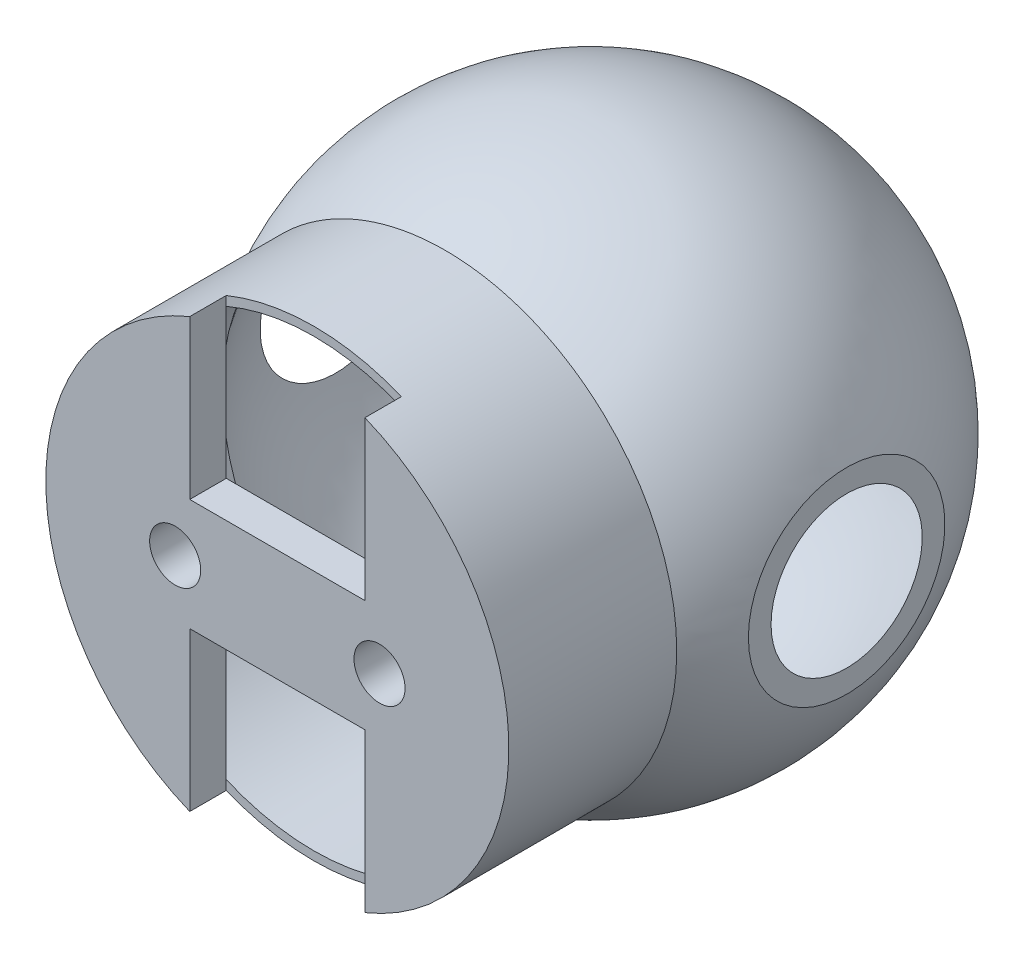
ISO-10303-21;
HEADER;
FILE_DESCRIPTION(('STEP AP214'),'2;1');
FILE_NAME('part.step','',(''),(''),'','','');
FILE_SCHEMA(('AUTOMOTIVE_DESIGN { 1 0 10303 214 1 1 1 1 }'));
ENDSEC;
DATA;
#1=APPLICATION_CONTEXT('core data for automotive mechanical design processes');
#2=APPLICATION_PROTOCOL_DEFINITION('international standard','automotive_design',2000,#1);
#3=PRODUCT_CONTEXT('',#1,'mechanical');
#4=PRODUCT('Part','Part','',(#3));
#5=PRODUCT_RELATED_PRODUCT_CATEGORY('part','',(#4));
#6=PRODUCT_DEFINITION_FORMATION('','',#4);
#7=PRODUCT_DEFINITION_CONTEXT('part definition',#1,'design');
#8=PRODUCT_DEFINITION('design','',#6,#7);
#9=PRODUCT_DEFINITION_SHAPE('','',#8);
#10=(LENGTH_UNIT() NAMED_UNIT(*) SI_UNIT(.MILLI.,.METRE.));
#11=(NAMED_UNIT(*) PLANE_ANGLE_UNIT() SI_UNIT($,.RADIAN.));
#12=(NAMED_UNIT(*) SI_UNIT($,.STERADIAN.) SOLID_ANGLE_UNIT());
#13=UNCERTAINTY_MEASURE_WITH_UNIT(LENGTH_MEASURE(1.E-05),#10,'distance_accuracy_value','');
#14=(GEOMETRIC_REPRESENTATION_CONTEXT(3) GLOBAL_UNCERTAINTY_ASSIGNED_CONTEXT((#13)) GLOBAL_UNIT_ASSIGNED_CONTEXT((#10,
#11,#12)) REPRESENTATION_CONTEXT('',''));
#15=CARTESIAN_POINT('',(0.,0.,0.));
#16=DIRECTION('',(0.,0.,1.));
#17=DIRECTION('',(1.,0.,0.));
#18=AXIS2_PLACEMENT_3D('',#15,#16,#17);
#19=CARTESIAN_POINT('',(0.,0.,38.));
#20=DIRECTION('',(0.,0.,1.));
#21=DIRECTION('',(1.,0.,0.));
#22=AXIS2_PLACEMENT_3D('',#19,#20,#21);
#23=PLANE('',#22);
#24=DIRECTION('',(0.,-1.,0.));
#25=VECTOR('',#24,1.);
#26=CARTESIAN_POINT('',(12.,29.364093720052,38.));
#27=LINE('',#26,#25);
#28=CARTESIAN_POINT('',(12.,29.364093720052,38.));
#29=VERTEX_POINT('',#28);
#30=CARTESIAN_POINT('',(12.,28.0757902827329,38.));
#31=VERTEX_POINT('',#30);
#32=EDGE_CURVE('E206',#29,#31,#27,.T.);
#33=ORIENTED_EDGE('',*,*,#32,.F.);
#34=CARTESIAN_POINT('',(0.,0.,38.));
#35=DIRECTION('',(0.,0.,1.));
#36=DIRECTION('',(1.,0.,0.));
#37=AXIS2_PLACEMENT_3D('',#34,#35,#36);
#38=CIRCLE('',#37,31.7214438511238);
#39=CARTESIAN_POINT('',(-12.,29.364093720052,38.));
#40=VERTEX_POINT('',#39);
#41=EDGE_CURVE('E155',#29,#40,#38,.T.);
#42=ORIENTED_EDGE('',*,*,#41,.T.);
#43=DIRECTION('',(0.,1.,0.));
#44=VECTOR('',#43,1.);
#45=CARTESIAN_POINT('',(-12.,29.364093720052,38.));
#46=LINE('',#45,#44);
#47=CARTESIAN_POINT('',(-12.,28.0757902827329,38.));
#48=VERTEX_POINT('',#47);
#49=EDGE_CURVE('E44',#48,#40,#46,.T.);
#50=ORIENTED_EDGE('',*,*,#49,.F.);
#51=CARTESIAN_POINT('',(0.,0.,38.));
#52=DIRECTION('',(0.,0.,1.));
#53=DIRECTION('',(1.,0.,0.));
#54=AXIS2_PLACEMENT_3D('',#51,#52,#53);
#55=CIRCLE('',#54,30.532769281544);
#56=EDGE_CURVE('E140',#31,#48,#55,.T.);
#57=ORIENTED_EDGE('',*,*,#56,.F.);
#58=EDGE_LOOP('',(#33,#42,#50,#57));
#59=FACE_BOUND('',#58,.T.);
#60=ADVANCED_FACE('F35',(#59),#23,.T.);
#61=CARTESIAN_POINT('',(0.,0.,0.));
#62=DIRECTION('',(0.,1.,0.));
#63=DIRECTION('',(-1.,0.,0.));
#64=AXIS2_PLACEMENT_3D('',#61,#62,#63);
#65=SPHERICAL_SURFACE('',#64,37.5);
#66=CARTESIAN_POINT('',(35.,0.,0.));
#67=DIRECTION('',(-1.,0.,0.));
#68=DIRECTION('',(0.,0.,1.));
#69=AXIS2_PLACEMENT_3D('',#66,#67,#68);
#70=CIRCLE('',#69,13.4629120178363);
#71=CARTESIAN_POINT('',(35.,0.,13.4629120178363));
#72=VERTEX_POINT('',#71);
#73=EDGE_CURVE('E154',#72,#72,#70,.F.);
#74=ORIENTED_EDGE('',*,*,#73,.F.);
#75=EDGE_LOOP('',(#74));
#76=FACE_BOUND('',#75,.T.);
#77=CARTESIAN_POINT('',(-35.,0.,0.));
#78=DIRECTION('',(1.,0.,0.));
#79=DIRECTION('',(0.,0.,-1.));
#80=AXIS2_PLACEMENT_3D('',#77,#78,#79);
#81=CIRCLE('',#80,13.4629120178363);
#82=CARTESIAN_POINT('',(-35.,0.,-13.4629120178363));
#83=VERTEX_POINT('',#82);
#84=EDGE_CURVE('E161',#83,#83,#81,.F.);
#85=ORIENTED_EDGE('',*,*,#84,.F.);
#86=EDGE_LOOP('',(#85));
#87=FACE_BOUND('',#86,.T.);
#88=CARTESIAN_POINT('',(0.,0.,20.));
#89=DIRECTION('',(0.,0.,1.));
#90=DIRECTION('',(1.,0.,0.));
#91=AXIS2_PLACEMENT_3D('',#88,#89,#90);
#92=CIRCLE('',#91,31.7214438511238);
#93=CARTESIAN_POINT('',(31.7214438511238,0.,20.));
#94=VERTEX_POINT('',#93);
#95=EDGE_CURVE('E146',#94,#94,#92,.T.);
#96=ORIENTED_EDGE('',*,*,#95,.F.);
#97=EDGE_LOOP('',(#96));
#98=FACE_BOUND('',#97,.T.);
#99=ADVANCED_FACE('F37',(#76,#87,#98),#65,.T.);
#100=CARTESIAN_POINT('',(0.,0.,0.));
#101=DIRECTION('',(0.,1.,0.));
#102=DIRECTION('',(-1.,0.,0.));
#103=AXIS2_PLACEMENT_3D('',#100,#101,#102);
#104=SPHERICAL_SURFACE('',#103,36.5);
#105=CARTESIAN_POINT('',(35.,0.,0.));
#106=DIRECTION('',(-1.,0.,0.));
#107=DIRECTION('',(0.,0.,1.));
#108=AXIS2_PLACEMENT_3D('',#105,#106,#107);
#109=CIRCLE('',#108,10.356157588604);
#110=CARTESIAN_POINT('',(35.,0.,10.356157588604));
#111=VERTEX_POINT('',#110);
#112=EDGE_CURVE('E151',#111,#111,#109,.F.);
#113=ORIENTED_EDGE('',*,*,#112,.T.);
#114=EDGE_LOOP('',(#113));
#115=FACE_BOUND('',#114,.T.);
#116=CARTESIAN_POINT('',(-35.,0.,0.));
#117=DIRECTION('',(1.,0.,0.));
#118=DIRECTION('',(0.,0.,-1.));
#119=AXIS2_PLACEMENT_3D('',#116,#117,#118);
#120=CIRCLE('',#119,10.356157588604);
#121=CARTESIAN_POINT('',(-35.,0.,-10.356157588604));
#122=VERTEX_POINT('',#121);
#123=EDGE_CURVE('E158',#122,#122,#120,.F.);
#124=ORIENTED_EDGE('',*,*,#123,.T.);
#125=EDGE_LOOP('',(#124));
#126=FACE_BOUND('',#125,.T.);
#127=CARTESIAN_POINT('',(0.,0.,20.));
#128=DIRECTION('',(0.,0.,1.));
#129=DIRECTION('',(1.,0.,0.));
#130=AXIS2_PLACEMENT_3D('',#127,#128,#129);
#131=CIRCLE('',#130,30.532769281544);
#132=CARTESIAN_POINT('',(30.532769281544,0.,20.));
#133=VERTEX_POINT('',#132);
#134=EDGE_CURVE('E164',#133,#133,#131,.F.);
#135=ORIENTED_EDGE('',*,*,#134,.F.);
#136=EDGE_LOOP('',(#135));
#137=FACE_BOUND('',#136,.T.);
#138=ADVANCED_FACE('F257',(#115,#126,#137),#104,.F.);
#139=CARTESIAN_POINT('',(-35.,0.,0.));
#140=DIRECTION('',(1.,0.,0.));
#141=DIRECTION('',(0.,0.,-1.));
#142=AXIS2_PLACEMENT_3D('',#139,#140,#141);
#143=PLANE('',#142);
#144=ORIENTED_EDGE('',*,*,#123,.F.);
#145=EDGE_LOOP('',(#144));
#146=FACE_BOUND('',#145,.T.);
#147=ORIENTED_EDGE('',*,*,#84,.T.);
#148=EDGE_LOOP('',(#147));
#149=FACE_BOUND('',#148,.T.);
#150=ADVANCED_FACE('F267',(#146,#149),#143,.F.);
#151=CARTESIAN_POINT('',(35.,0.,0.));
#152=DIRECTION('',(-1.,0.,0.));
#153=DIRECTION('',(0.,0.,-1.));
#154=AXIS2_PLACEMENT_3D('',#151,#152,#153);
#155=PLANE('',#154);
#156=ORIENTED_EDGE('',*,*,#112,.F.);
#157=EDGE_LOOP('',(#156));
#158=FACE_BOUND('',#157,.T.);
#159=ORIENTED_EDGE('',*,*,#73,.T.);
#160=EDGE_LOOP('',(#159));
#161=FACE_BOUND('',#160,.T.);
#162=ADVANCED_FACE('F261',(#158,#161),#155,.F.);
#163=DIRECTION('',(0.,-1.,0.));
#164=VECTOR('',#163,1.);
#165=CARTESIAN_POINT('',(12.,-7.66336994854413,38.));
#166=LINE('',#165,#164);
#167=CARTESIAN_POINT('',(12.,-28.0757902827329,38.));
#168=VERTEX_POINT('',#167);
#169=CARTESIAN_POINT('',(12.,-29.364093720052,38.));
#170=VERTEX_POINT('',#169);
#171=EDGE_CURVE('E11',#168,#170,#166,.T.);
#172=ORIENTED_EDGE('',*,*,#171,.F.);
#173=CARTESIAN_POINT('',(-12.,-28.0757902827329,38.));
#174=VERTEX_POINT('',#173);
#175=EDGE_CURVE('E54',#174,#168,#55,.T.);
#176=ORIENTED_EDGE('',*,*,#175,.F.);
#177=DIRECTION('',(0.,1.,0.));
#178=VECTOR('',#177,1.);
#179=CARTESIAN_POINT('',(-12.,-7.66336994854413,38.));
#180=LINE('',#179,#178);
#181=CARTESIAN_POINT('',(-12.,-29.364093720052,38.));
#182=VERTEX_POINT('',#181);
#183=EDGE_CURVE('E186',#182,#174,#180,.T.);
#184=ORIENTED_EDGE('',*,*,#183,.F.);
#185=EDGE_CURVE('E150',#182,#170,#38,.T.);
#186=ORIENTED_EDGE('',*,*,#185,.T.);
#187=EDGE_LOOP('',(#172,#176,#184,#186));
#188=FACE_BOUND('',#187,.T.);
#189=ADVANCED_FACE('F253',(#188),#23,.T.);
#190=CARTESIAN_POINT('',(0.,0.,38.));
#191=DIRECTION('',(0.,0.,-1.));
#192=DIRECTION('',(-1.,0.,0.));
#193=AXIS2_PLACEMENT_3D('',#190,#191,#192);
#194=CYLINDRICAL_SURFACE('',#193,31.7214438511238);
#195=ORIENTED_EDGE('',*,*,#41,.F.);
#196=DIRECTION('',(0.,0.,-1.));
#197=VECTOR('',#196,1.);
#198=CARTESIAN_POINT('',(12.,29.364093720052,43.));
#199=LINE('',#198,#197);
#200=CARTESIAN_POINT('',(12.,29.364093720052,43.));
#201=VERTEX_POINT('',#200);
#202=EDGE_CURVE('E203',#201,#29,#199,.T.);
#203=ORIENTED_EDGE('',*,*,#202,.F.);
#204=CARTESIAN_POINT('',(0.,0.,43.));
#205=DIRECTION('',(0.,0.,1.));
#206=DIRECTION('',(1.,0.,0.));
#207=AXIS2_PLACEMENT_3D('',#204,#205,#206);
#208=CIRCLE('',#207,31.7214438511238);
#209=CARTESIAN_POINT('',(12.,-29.364093720052,43.));
#210=VERTEX_POINT('',#209);
#211=EDGE_CURVE('E126',#210,#201,#208,.T.);
#212=ORIENTED_EDGE('',*,*,#211,.F.);
#213=DIRECTION('',(0.,0.,-1.));
#214=VECTOR('',#213,1.);
#215=CARTESIAN_POINT('',(12.,-29.364093720052,43.));
#216=LINE('',#215,#214);
#217=EDGE_CURVE('E199',#210,#170,#216,.T.);
#218=ORIENTED_EDGE('',*,*,#217,.T.);
#219=ORIENTED_EDGE('',*,*,#185,.F.);
#220=DIRECTION('',(0.,0.,-1.));
#221=VECTOR('',#220,1.);
#222=CARTESIAN_POINT('',(-12.,-29.364093720052,43.));
#223=LINE('',#222,#221);
#224=CARTESIAN_POINT('',(-12.,-29.364093720052,43.));
#225=VERTEX_POINT('',#224);
#226=EDGE_CURVE('E193',#225,#182,#223,.T.);
#227=ORIENTED_EDGE('',*,*,#226,.F.);
#228=CARTESIAN_POINT('',(0.,0.,43.));
#229=DIRECTION('',(0.,0.,1.));
#230=DIRECTION('',(1.,0.,0.));
#231=AXIS2_PLACEMENT_3D('',#228,#229,#230);
#232=CIRCLE('',#231,31.7214438511238);
#233=CARTESIAN_POINT('',(-12.,29.364093720052,43.));
#234=VERTEX_POINT('',#233);
#235=EDGE_CURVE('E217',#234,#225,#232,.T.);
#236=ORIENTED_EDGE('',*,*,#235,.F.);
#237=DIRECTION('',(0.,0.,-1.));
#238=VECTOR('',#237,1.);
#239=CARTESIAN_POINT('',(-12.,29.364093720052,43.));
#240=LINE('',#239,#238);
#241=EDGE_CURVE('E141',#234,#40,#240,.T.);
#242=ORIENTED_EDGE('',*,*,#241,.T.);
#243=EDGE_LOOP('',(#195,#203,#212,#218,#219,#227,#236,#242));
#244=FACE_BOUND('',#243,.T.);
#245=ORIENTED_EDGE('',*,*,#95,.T.);
#246=EDGE_LOOP('',(#245));
#247=FACE_BOUND('',#246,.T.);
#248=ADVANCED_FACE('F245',(#244,#247),#194,.T.);
#249=CARTESIAN_POINT('',(0.,0.,38.));
#250=DIRECTION('',(0.,0.,-1.));
#251=DIRECTION('',(-1.,0.,0.));
#252=AXIS2_PLACEMENT_3D('',#249,#250,#251);
#253=CYLINDRICAL_SURFACE('',#252,30.532769281544);
#254=ORIENTED_EDGE('',*,*,#56,.T.);
#255=EDGE_CURVE('E147',#48,#174,#55,.T.);
#256=ORIENTED_EDGE('',*,*,#255,.T.);
#257=ORIENTED_EDGE('',*,*,#175,.T.);
#258=EDGE_CURVE('E137',#168,#31,#55,.T.);
#259=ORIENTED_EDGE('',*,*,#258,.T.);
#260=EDGE_LOOP('',(#254,#256,#257,#259));
#261=FACE_BOUND('',#260,.T.);
#262=ORIENTED_EDGE('',*,*,#134,.T.);
#263=EDGE_LOOP('',(#262));
#264=FACE_BOUND('',#263,.T.);
#265=ADVANCED_FACE('F236',(#261,#264),#253,.F.);
#266=CARTESIAN_POINT('',(0.,0.,43.));
#267=DIRECTION('',(0.,0.,1.));
#268=DIRECTION('',(1.,0.,0.));
#269=AXIS2_PLACEMENT_3D('',#266,#267,#268);
#270=PLANE('',#269);
#271=CARTESIAN_POINT('',(14.,0.,43.));
#272=DIRECTION('',(0.,0.,1.));
#273=DIRECTION('',(1.,0.,0.));
#274=AXIS2_PLACEMENT_3D('',#271,#272,#273);
#275=CIRCLE('',#274,3.5);
#276=CARTESIAN_POINT('',(17.5,0.,43.));
#277=VERTEX_POINT('',#276);
#278=EDGE_CURVE('E209',#277,#277,#275,.T.);
#279=ORIENTED_EDGE('',*,*,#278,.F.);
#280=EDGE_LOOP('',(#279));
#281=FACE_BOUND('',#280,.T.);
#282=DIRECTION('',(0.,-1.,0.));
#283=VECTOR('',#282,1.);
#284=CARTESIAN_POINT('',(12.,29.364093720052,43.));
#285=LINE('',#284,#283);
#286=CARTESIAN_POINT('',(12.,7.66336994854413,43.));
#287=VERTEX_POINT('',#286);
#288=EDGE_CURVE('E120',#201,#287,#285,.T.);
#289=ORIENTED_EDGE('',*,*,#288,.T.);
#290=DIRECTION('',(-1.,0.,0.));
#291=VECTOR('',#290,1.);
#292=CARTESIAN_POINT('',(-12.,7.66336994854413,43.));
#293=LINE('',#292,#291);
#294=CARTESIAN_POINT('',(-12.,7.66336994854413,43.));
#295=VERTEX_POINT('',#294);
#296=EDGE_CURVE('E110',#287,#295,#293,.T.);
#297=ORIENTED_EDGE('',*,*,#296,.T.);
#298=DIRECTION('',(0.,1.,0.));
#299=VECTOR('',#298,1.);
#300=CARTESIAN_POINT('',(-12.,29.364093720052,43.));
#301=LINE('',#300,#299);
#302=EDGE_CURVE('E119',#295,#234,#301,.T.);
#303=ORIENTED_EDGE('',*,*,#302,.T.);
#304=ORIENTED_EDGE('',*,*,#235,.T.);
#305=DIRECTION('',(0.,1.,0.));
#306=VECTOR('',#305,1.);
#307=CARTESIAN_POINT('',(-12.,-7.66336994854413,43.));
#308=LINE('',#307,#306);
#309=CARTESIAN_POINT('',(-12.,-7.66336994854413,43.));
#310=VERTEX_POINT('',#309);
#311=EDGE_CURVE('E215',#225,#310,#308,.T.);
#312=ORIENTED_EDGE('',*,*,#311,.T.);
#313=DIRECTION('',(1.,0.,0.));
#314=VECTOR('',#313,1.);
#315=CARTESIAN_POINT('',(-12.,-7.66336994854413,43.));
#316=LINE('',#315,#314);
#317=CARTESIAN_POINT('',(12.,-7.66336994854413,43.));
#318=VERTEX_POINT('',#317);
#319=EDGE_CURVE('E213',#310,#318,#316,.T.);
#320=ORIENTED_EDGE('',*,*,#319,.T.);
#321=DIRECTION('',(0.,-1.,0.));
#322=VECTOR('',#321,1.);
#323=CARTESIAN_POINT('',(12.,-7.66336994854413,43.));
#324=LINE('',#323,#322);
#325=EDGE_CURVE('E211',#318,#210,#324,.T.);
#326=ORIENTED_EDGE('',*,*,#325,.T.);
#327=ORIENTED_EDGE('',*,*,#211,.T.);
#328=EDGE_LOOP('',(#289,#297,#303,#304,#312,#320,#326,#327));
#329=FACE_BOUND('',#328,.T.);
#330=CARTESIAN_POINT('',(-14.,0.,43.));
#331=DIRECTION('',(0.,0.,1.));
#332=DIRECTION('',(-1.,0.,0.));
#333=AXIS2_PLACEMENT_3D('',#330,#331,#332);
#334=CIRCLE('',#333,3.5);
#335=CARTESIAN_POINT('',(-17.5,0.,43.));
#336=VERTEX_POINT('',#335);
#337=EDGE_CURVE('E223',#336,#336,#334,.T.);
#338=ORIENTED_EDGE('',*,*,#337,.F.);
#339=EDGE_LOOP('',(#338));
#340=FACE_BOUND('',#339,.T.);
#341=ADVANCED_FACE('F123',(#281,#329,#340),#270,.T.);
#342=CARTESIAN_POINT('',(0.,0.,38.));
#343=DIRECTION('',(0.,0.,1.));
#344=DIRECTION('',(1.,0.,0.));
#345=AXIS2_PLACEMENT_3D('',#342,#343,#344);
#346=PLANE('',#345);
#347=ORIENTED_EDGE('',*,*,#255,.F.);
#348=CARTESIAN_POINT('',(-12.,7.66336994854413,38.));
#349=VERTEX_POINT('',#348);
#350=EDGE_CURVE('E176',#349,#48,#46,.T.);
#351=ORIENTED_EDGE('',*,*,#350,.F.);
#352=DIRECTION('',(-1.,0.,0.));
#353=VECTOR('',#352,1.);
#354=CARTESIAN_POINT('',(-12.,7.66336994854413,38.));
#355=LINE('',#354,#353);
#356=CARTESIAN_POINT('',(12.,7.66336994854413,38.));
#357=VERTEX_POINT('',#356);
#358=EDGE_CURVE('E182',#357,#349,#355,.T.);
#359=ORIENTED_EDGE('',*,*,#358,.F.);
#360=EDGE_CURVE('E135',#31,#357,#27,.T.);
#361=ORIENTED_EDGE('',*,*,#360,.F.);
#362=ORIENTED_EDGE('',*,*,#258,.F.);
#363=CARTESIAN_POINT('',(12.,-7.66336994854413,38.));
#364=VERTEX_POINT('',#363);
#365=EDGE_CURVE('E130',#364,#168,#166,.T.);
#366=ORIENTED_EDGE('',*,*,#365,.F.);
#367=DIRECTION('',(1.,0.,0.));
#368=VECTOR('',#367,1.);
#369=CARTESIAN_POINT('',(-12.,-7.66336994854413,38.));
#370=LINE('',#369,#368);
#371=CARTESIAN_POINT('',(-12.,-7.66336994854413,38.));
#372=VERTEX_POINT('',#371);
#373=EDGE_CURVE('E187',#372,#364,#370,.T.);
#374=ORIENTED_EDGE('',*,*,#373,.F.);
#375=EDGE_CURVE('E181',#174,#372,#180,.T.);
#376=ORIENTED_EDGE('',*,*,#375,.F.);
#377=EDGE_LOOP('',(#347,#351,#359,#361,#362,#366,#374,#376));
#378=FACE_BOUND('',#377,.T.);
#379=CARTESIAN_POINT('',(14.,0.,38.));
#380=DIRECTION('',(0.,0.,1.));
#381=DIRECTION('',(1.,0.,0.));
#382=AXIS2_PLACEMENT_3D('',#379,#380,#381);
#383=CIRCLE('',#382,3.5);
#384=CARTESIAN_POINT('',(17.5,0.,38.));
#385=VERTEX_POINT('',#384);
#386=EDGE_CURVE('E220',#385,#385,#383,.T.);
#387=ORIENTED_EDGE('',*,*,#386,.T.);
#388=EDGE_LOOP('',(#387));
#389=FACE_BOUND('',#388,.T.);
#390=CARTESIAN_POINT('',(-14.,0.,38.));
#391=DIRECTION('',(0.,0.,1.));
#392=DIRECTION('',(-1.,0.,0.));
#393=AXIS2_PLACEMENT_3D('',#390,#391,#392);
#394=CIRCLE('',#393,3.5);
#395=CARTESIAN_POINT('',(-17.5,0.,38.));
#396=VERTEX_POINT('',#395);
#397=EDGE_CURVE('E226',#396,#396,#394,.T.);
#398=ORIENTED_EDGE('',*,*,#397,.T.);
#399=EDGE_LOOP('',(#398));
#400=FACE_BOUND('',#399,.T.);
#401=ADVANCED_FACE('F235',(#378,#389,#400),#346,.F.);
#402=CARTESIAN_POINT('',(12.,29.364093720052,43.));
#403=DIRECTION('',(1.,0.,0.));
#404=DIRECTION('',(0.,1.,0.));
#405=AXIS2_PLACEMENT_3D('',#402,#403,#404);
#406=PLANE('',#405);
#407=ORIENTED_EDGE('',*,*,#32,.T.);
#408=ORIENTED_EDGE('',*,*,#360,.T.);
#409=DIRECTION('',(0.,0.,-1.));
#410=VECTOR('',#409,1.);
#411=CARTESIAN_POINT('',(12.,7.66336994854413,43.));
#412=LINE('',#411,#410);
#413=EDGE_CURVE('E114',#287,#357,#412,.T.);
#414=ORIENTED_EDGE('',*,*,#413,.F.);
#415=ORIENTED_EDGE('',*,*,#288,.F.);
#416=ORIENTED_EDGE('',*,*,#202,.T.);
#417=EDGE_LOOP('',(#407,#408,#414,#415,#416));
#418=FACE_BOUND('',#417,.T.);
#419=ADVANCED_FACE('F133',(#418),#406,.F.);
#420=CARTESIAN_POINT('',(-12.,7.66336994854413,43.));
#421=DIRECTION('',(0.,-1.,0.));
#422=DIRECTION('',(1.,0.,0.));
#423=AXIS2_PLACEMENT_3D('',#420,#421,#422);
#424=PLANE('',#423);
#425=ORIENTED_EDGE('',*,*,#358,.T.);
#426=DIRECTION('',(0.,0.,-1.));
#427=VECTOR('',#426,1.);
#428=CARTESIAN_POINT('',(-12.,7.66336994854413,43.));
#429=LINE('',#428,#427);
#430=EDGE_CURVE('E116',#295,#349,#429,.T.);
#431=ORIENTED_EDGE('',*,*,#430,.F.);
#432=ORIENTED_EDGE('',*,*,#296,.F.);
#433=ORIENTED_EDGE('',*,*,#413,.T.);
#434=EDGE_LOOP('',(#425,#431,#432,#433));
#435=FACE_BOUND('',#434,.T.);
#436=ADVANCED_FACE('F112',(#435),#424,.F.);
#437=CARTESIAN_POINT('',(-12.,29.364093720052,43.));
#438=DIRECTION('',(-1.,0.,0.));
#439=DIRECTION('',(0.,-1.,0.));
#440=AXIS2_PLACEMENT_3D('',#437,#438,#439);
#441=PLANE('',#440);
#442=ORIENTED_EDGE('',*,*,#350,.T.);
#443=ORIENTED_EDGE('',*,*,#49,.T.);
#444=ORIENTED_EDGE('',*,*,#241,.F.);
#445=ORIENTED_EDGE('',*,*,#302,.F.);
#446=ORIENTED_EDGE('',*,*,#430,.T.);
#447=EDGE_LOOP('',(#442,#443,#444,#445,#446));
#448=FACE_BOUND('',#447,.T.);
#449=ADVANCED_FACE('F358',(#448),#441,.F.);
#450=CARTESIAN_POINT('',(-12.,-7.66336994854413,43.));
#451=DIRECTION('',(-1.,0.,0.));
#452=DIRECTION('',(0.,-1.,0.));
#453=AXIS2_PLACEMENT_3D('',#450,#451,#452);
#454=PLANE('',#453);
#455=ORIENTED_EDGE('',*,*,#183,.T.);
#456=ORIENTED_EDGE('',*,*,#375,.T.);
#457=DIRECTION('',(0.,0.,-1.));
#458=VECTOR('',#457,1.);
#459=CARTESIAN_POINT('',(-12.,-7.66336994854413,43.));
#460=LINE('',#459,#458);
#461=EDGE_CURVE('E196',#310,#372,#460,.T.);
#462=ORIENTED_EDGE('',*,*,#461,.F.);
#463=ORIENTED_EDGE('',*,*,#311,.F.);
#464=ORIENTED_EDGE('',*,*,#226,.T.);
#465=EDGE_LOOP('',(#455,#456,#462,#463,#464));
#466=FACE_BOUND('',#465,.T.);
#467=ADVANCED_FACE('F367',(#466),#454,.F.);
#468=CARTESIAN_POINT('',(-12.,-7.66336994854413,43.));
#469=DIRECTION('',(0.,1.,0.));
#470=DIRECTION('',(0.,0.,1.));
#471=AXIS2_PLACEMENT_3D('',#468,#469,#470);
#472=PLANE('',#471);
#473=ORIENTED_EDGE('',*,*,#373,.T.);
#474=DIRECTION('',(0.,0.,-1.));
#475=VECTOR('',#474,1.);
#476=CARTESIAN_POINT('',(12.,-7.66336994854413,43.));
#477=LINE('',#476,#475);
#478=EDGE_CURVE('E202',#318,#364,#477,.T.);
#479=ORIENTED_EDGE('',*,*,#478,.F.);
#480=ORIENTED_EDGE('',*,*,#319,.F.);
#481=ORIENTED_EDGE('',*,*,#461,.T.);
#482=EDGE_LOOP('',(#473,#479,#480,#481));
#483=FACE_BOUND('',#482,.T.);
#484=ADVANCED_FACE('F377',(#483),#472,.F.);
#485=CARTESIAN_POINT('',(12.,-7.66336994854413,43.));
#486=DIRECTION('',(1.,0.,0.));
#487=DIRECTION('',(0.,1.,0.));
#488=AXIS2_PLACEMENT_3D('',#485,#486,#487);
#489=PLANE('',#488);
#490=ORIENTED_EDGE('',*,*,#365,.T.);
#491=ORIENTED_EDGE('',*,*,#171,.T.);
#492=ORIENTED_EDGE('',*,*,#217,.F.);
#493=ORIENTED_EDGE('',*,*,#325,.F.);
#494=ORIENTED_EDGE('',*,*,#478,.T.);
#495=EDGE_LOOP('',(#490,#491,#492,#493,#494));
#496=FACE_BOUND('',#495,.T.);
#497=ADVANCED_FACE('F387',(#496),#489,.F.);
#498=CARTESIAN_POINT('',(14.,0.,43.));
#499=DIRECTION('',(0.,0.,-1.));
#500=DIRECTION('',(-1.,0.,0.));
#501=AXIS2_PLACEMENT_3D('',#498,#499,#500);
#502=CYLINDRICAL_SURFACE('',#501,3.5);
#503=ORIENTED_EDGE('',*,*,#278,.T.);
#504=EDGE_LOOP('',(#503));
#505=FACE_BOUND('',#504,.T.);
#506=ORIENTED_EDGE('',*,*,#386,.F.);
#507=EDGE_LOOP('',(#506));
#508=FACE_BOUND('',#507,.T.);
#509=ADVANCED_FACE('F397',(#505,#508),#502,.F.);
#510=CARTESIAN_POINT('',(-14.,0.,43.));
#511=DIRECTION('',(0.,0.,-1.));
#512=DIRECTION('',(-1.,0.,0.));
#513=AXIS2_PLACEMENT_3D('',#510,#511,#512);
#514=CYLINDRICAL_SURFACE('',#513,3.5);
#515=ORIENTED_EDGE('',*,*,#337,.T.);
#516=EDGE_LOOP('',(#515));
#517=FACE_BOUND('',#516,.T.);
#518=ORIENTED_EDGE('',*,*,#397,.F.);
#519=EDGE_LOOP('',(#518));
#520=FACE_BOUND('',#519,.T.);
#521=ADVANCED_FACE('F232',(#517,#520),#514,.F.);
#522=CLOSED_SHELL('',(#60,#99,#138,#150,#162,#189,#248,#265,#341,#401,#419,#436,#449,#467,#484,
#497,#509,#521));
#523=MANIFOLD_SOLID_BREP('B2',#522);
#524=ADVANCED_BREP_SHAPE_REPRESENTATION('',(#18,#523),#14);
#525=SHAPE_DEFINITION_REPRESENTATION(#9,#524);
ENDSEC;
END-ISO-10303-21;
